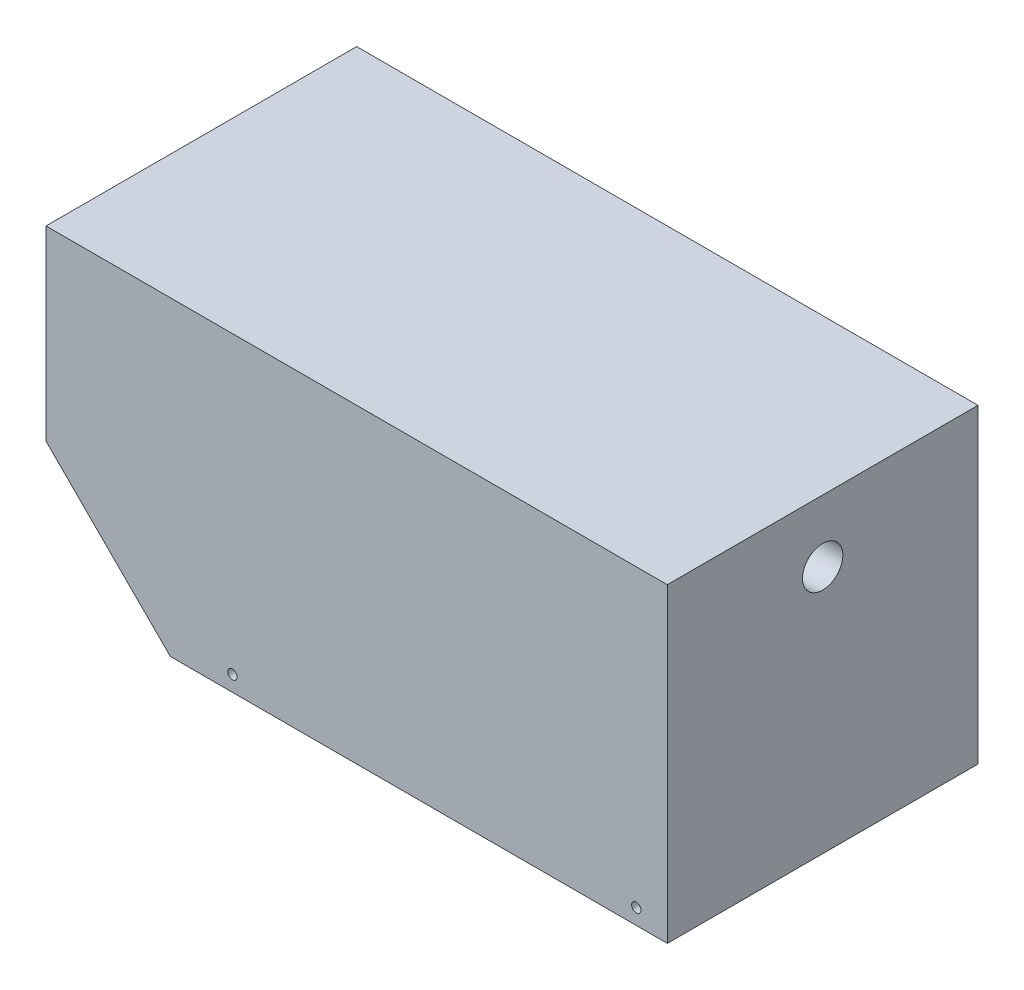
ISO-10303-21;
HEADER;
FILE_DESCRIPTION(('STEP AP214'),'2;1');
FILE_NAME('part.step','',(''),(''),'','','');
FILE_SCHEMA(('AUTOMOTIVE_DESIGN { 1 0 10303 214 1 1 1 1 }'));
ENDSEC;
DATA;
#1=APPLICATION_CONTEXT('core data for automotive mechanical design processes');
#2=APPLICATION_PROTOCOL_DEFINITION('international standard','automotive_design',2000,#1);
#3=PRODUCT_CONTEXT('',#1,'mechanical');
#4=PRODUCT('Part','Part','',(#3));
#5=PRODUCT_RELATED_PRODUCT_CATEGORY('part','',(#4));
#6=PRODUCT_DEFINITION_FORMATION('','',#4);
#7=PRODUCT_DEFINITION_CONTEXT('part definition',#1,'design');
#8=PRODUCT_DEFINITION('design','',#6,#7);
#9=PRODUCT_DEFINITION_SHAPE('','',#8);
#10=(LENGTH_UNIT() NAMED_UNIT(*) SI_UNIT(.MILLI.,.METRE.));
#11=(NAMED_UNIT(*) PLANE_ANGLE_UNIT() SI_UNIT($,.RADIAN.));
#12=(NAMED_UNIT(*) SI_UNIT($,.STERADIAN.) SOLID_ANGLE_UNIT());
#13=UNCERTAINTY_MEASURE_WITH_UNIT(LENGTH_MEASURE(1.E-05),#10,'distance_accuracy_value','');
#14=(GEOMETRIC_REPRESENTATION_CONTEXT(3) GLOBAL_UNCERTAINTY_ASSIGNED_CONTEXT((#13)) GLOBAL_UNIT_ASSIGNED_CONTEXT((#10,
#11,#12)) REPRESENTATION_CONTEXT('',''));
#15=CARTESIAN_POINT('',(0.,0.,0.));
#16=DIRECTION('',(0.,0.,1.));
#17=DIRECTION('',(1.,0.,0.));
#18=AXIS2_PLACEMENT_3D('',#15,#16,#17);
#19=CARTESIAN_POINT('',(-40.,-45.,0.));
#20=DIRECTION('',(0.,0.,1.));
#21=DIRECTION('',(1.,0.,0.));
#22=AXIS2_PLACEMENT_3D('',#19,#20,#21);
#23=CYLINDRICAL_SURFACE('',#22,1.5);
#24=CARTESIAN_POINT('',(-40.,-45.,3.99999999999998));
#25=DIRECTION('',(0.,0.,-1.));
#26=DIRECTION('',(-1.,0.,0.));
#27=AXIS2_PLACEMENT_3D('',#24,#25,#26);
#28=CIRCLE('',#27,1.5);
#29=CARTESIAN_POINT('',(-38.5,-45.,3.99999999999998));
#30=VERTEX_POINT('',#29);
#31=EDGE_CURVE('E149',#30,#30,#28,.F.);
#32=CARTESIAN_POINT('',(-40.,-45.,0.));
#33=DIRECTION('',(0.,0.,1.));
#34=DIRECTION('',(1.,0.,0.));
#35=AXIS2_PLACEMENT_3D('',#32,#33,#34);
#36=CIRCLE('',#35,1.5);
#37=CARTESIAN_POINT('',(-38.5,-45.,0.));
#38=VERTEX_POINT('',#37);
#39=EDGE_CURVE('E160',#38,#38,#36,.T.);
#40=CARTESIAN_POINT('',(-38.5,-45.,3.99999999999998));
#41=CARTESIAN_POINT('',(-38.5,-45.,3.95833333333332));
#42=CARTESIAN_POINT('',(-38.5,-45.,3.91666666666665));
#43=CARTESIAN_POINT('',(-38.5,-45.,3.83333333333332));
#44=CARTESIAN_POINT('',(-38.5,-45.,3.79166666666665));
#45=CARTESIAN_POINT('',(-38.5,-45.,3.70833333333332));
#46=CARTESIAN_POINT('',(-38.5,-45.,3.66666666666665));
#47=CARTESIAN_POINT('',(-38.5,-45.,3.58333333333332));
#48=CARTESIAN_POINT('',(-38.5,-45.,3.54166666666665));
#49=CARTESIAN_POINT('',(-38.5,-45.,3.45833333333332));
#50=CARTESIAN_POINT('',(-38.5,-45.,3.41666666666665));
#51=CARTESIAN_POINT('',(-38.5,-45.,3.33333333333332));
#52=CARTESIAN_POINT('',(-38.5,-45.,3.29166666666665));
#53=CARTESIAN_POINT('',(-38.5,-45.,3.20833333333332));
#54=CARTESIAN_POINT('',(-38.5,-45.,3.16666666666665));
#55=CARTESIAN_POINT('',(-38.5,-45.,3.08333333333332));
#56=CARTESIAN_POINT('',(-38.5,-45.,3.04166666666665));
#57=CARTESIAN_POINT('',(-38.5,-45.,2.95833333333332));
#58=CARTESIAN_POINT('',(-38.5,-45.,2.91666666666665));
#59=CARTESIAN_POINT('',(-38.5,-45.,2.83333333333332));
#60=CARTESIAN_POINT('',(-38.5,-45.,2.79166666666666));
#61=CARTESIAN_POINT('',(-38.5,-45.,2.70833333333332));
#62=CARTESIAN_POINT('',(-38.5,-45.,2.66666666666666));
#63=CARTESIAN_POINT('',(-38.5,-45.,2.58333333333332));
#64=CARTESIAN_POINT('',(-38.5,-45.,2.54166666666666));
#65=CARTESIAN_POINT('',(-38.5,-45.,2.45833333333332));
#66=CARTESIAN_POINT('',(-38.5,-45.,2.41666666666666));
#67=CARTESIAN_POINT('',(-38.5,-45.,2.33333333333332));
#68=CARTESIAN_POINT('',(-38.5,-45.,2.29166666666666));
#69=CARTESIAN_POINT('',(-38.5,-45.,2.20833333333332));
#70=CARTESIAN_POINT('',(-38.5,-45.,2.16666666666666));
#71=CARTESIAN_POINT('',(-38.5,-45.,2.08333333333332));
#72=CARTESIAN_POINT('',(-38.5,-45.,2.04166666666666));
#73=CARTESIAN_POINT('',(-38.5,-45.,1.95833333333333));
#74=CARTESIAN_POINT('',(-38.5,-45.,1.91666666666666));
#75=CARTESIAN_POINT('',(-38.5,-45.,1.83333333333333));
#76=CARTESIAN_POINT('',(-38.5,-45.,1.79166666666666));
#77=CARTESIAN_POINT('',(-38.5,-45.,1.70833333333333));
#78=CARTESIAN_POINT('',(-38.5,-45.,1.66666666666666));
#79=CARTESIAN_POINT('',(-38.5,-45.,1.58333333333333));
#80=CARTESIAN_POINT('',(-38.5,-45.,1.54166666666666));
#81=CARTESIAN_POINT('',(-38.5,-45.,1.45833333333333));
#82=CARTESIAN_POINT('',(-38.5,-45.,1.41666666666666));
#83=CARTESIAN_POINT('',(-38.5,-45.,1.33333333333333));
#84=CARTESIAN_POINT('',(-38.5,-45.,1.29166666666666));
#85=CARTESIAN_POINT('',(-38.5,-45.,1.20833333333333));
#86=CARTESIAN_POINT('',(-38.5,-45.,1.16666666666666));
#87=CARTESIAN_POINT('',(-38.5,-45.,1.08333333333333));
#88=CARTESIAN_POINT('',(-38.5,-45.,1.04166666666666));
#89=CARTESIAN_POINT('',(-38.5,-45.,0.958333333333329));
#90=CARTESIAN_POINT('',(-38.5,-45.,0.916666666666663));
#91=CARTESIAN_POINT('',(-38.5,-45.,0.83333333333333));
#92=CARTESIAN_POINT('',(-38.5,-45.,0.791666666666664));
#93=CARTESIAN_POINT('',(-38.5,-45.,0.708333333333331));
#94=CARTESIAN_POINT('',(-38.5,-45.,0.666666666666664));
#95=CARTESIAN_POINT('',(-38.5,-45.,0.583333333333331));
#96=CARTESIAN_POINT('',(-38.5,-45.,0.541666666666664));
#97=CARTESIAN_POINT('',(-38.5,-45.,0.458333333333331));
#98=CARTESIAN_POINT('',(-38.5,-45.,0.416666666666665));
#99=CARTESIAN_POINT('',(-38.5,-45.,0.333333333333332));
#100=CARTESIAN_POINT('',(-38.5,-45.,0.291666666666665));
#101=CARTESIAN_POINT('',(-38.5,-45.,0.208333333333332));
#102=CARTESIAN_POINT('',(-38.5,-45.,0.166666666666666));
#103=CARTESIAN_POINT('',(-38.5,-45.,0.0833333333333331));
#104=CARTESIAN_POINT('',(-38.5,-45.,0.0416666666666666));
#105=CARTESIAN_POINT('',(-38.5,-45.,0.));
#106=B_SPLINE_CURVE_WITH_KNOTS('',3,(#40,#41,#42,#43,#44,#45,#46,#47,#48,#49,#50,#51,#52,#53,
#54,#55,#56,#57,#58,#59,#60,#61,#62,#63,#64,#65,#66,#67,#68,#69,#70,#71,#72,#73,#74,#75,#76,#77,
#78,#79,#80,#81,#82,#83,#84,#85,#86,#87,#88,#89,#90,#91,#92,#93,#94,#95,#96,#97,#98,#99,#100,
#101,#102,#103,#104,#105),.UNSPECIFIED.,.F.,.F.,(4,2,2,2,2,2,2,2,2,2,2,2,2,2,2,2,2,2,2,2,2,2,2,
2,2,2,2,2,2,2,2,2,4),(0.,0.124999999999999,0.249999999999999,0.374999999999998,
0.499999999999997,0.624999999999997,0.749999999999997,0.874999999999996,0.999999999999996,1.125,
1.24999999999999,1.37499999999999,1.49999999999999,1.62499999999999,1.74999999999999,
1.87499999999999,1.99999999999999,2.12499999999999,2.24999999999999,2.37499999999999,
2.49999999999999,2.62499999999999,2.74999999999999,2.87499999999999,2.99999999999999,
3.12499999999999,3.24999999999999,3.37499999999999,3.49999999999999,3.62499999999999,
3.74999999999998,3.87499999999998,3.99999999999998),.UNSPECIFIED.);
#107=EDGE_CURVE('BSEAM33',#30,#38,#106,.T.);
#108=ORIENTED_EDGE('',*,*,#31,.T.);
#109=ORIENTED_EDGE('',*,*,#39,.F.);
#110=ORIENTED_EDGE('',*,*,#107,.T.);
#111=ORIENTED_EDGE('',*,*,#107,.F.);
#112=EDGE_LOOP('',(#108,#110,#109,#111));
#113=FACE_BOUND('',#112,.T.);
#114=ADVANCED_FACE('F33',(#113),#23,.F.);
#115=CARTESIAN_POINT('',(90.,-45.,0.));
#116=DIRECTION('',(0.,0.,1.));
#117=DIRECTION('',(1.,0.,0.));
#118=AXIS2_PLACEMENT_3D('',#115,#116,#117);
#119=CYLINDRICAL_SURFACE('',#118,1.5);
#120=CARTESIAN_POINT('',(90.,-45.,4.));
#121=DIRECTION('',(0.,0.,-1.));
#122=DIRECTION('',(-1.,0.,0.));
#123=AXIS2_PLACEMENT_3D('',#120,#121,#122);
#124=CIRCLE('',#123,1.5);
#125=CARTESIAN_POINT('',(91.5,-45.,4.));
#126=VERTEX_POINT('',#125);
#127=EDGE_CURVE('E37',#126,#126,#124,.F.);
#128=CARTESIAN_POINT('',(90.,-45.,0.));
#129=DIRECTION('',(0.,0.,1.));
#130=DIRECTION('',(1.,0.,0.));
#131=AXIS2_PLACEMENT_3D('',#128,#129,#130);
#132=CIRCLE('',#131,1.5);
#133=CARTESIAN_POINT('',(91.5,-45.,0.));
#134=VERTEX_POINT('',#133);
#135=EDGE_CURVE('E153',#134,#134,#132,.T.);
#136=CARTESIAN_POINT('',(91.5,-45.,4.));
#137=CARTESIAN_POINT('',(91.5,-45.,3.95833333333333));
#138=CARTESIAN_POINT('',(91.5,-45.,3.91666666666667));
#139=CARTESIAN_POINT('',(91.5,-45.,3.83333333333333));
#140=CARTESIAN_POINT('',(91.5,-45.,3.79166666666667));
#141=CARTESIAN_POINT('',(91.5,-45.,3.70833333333333));
#142=CARTESIAN_POINT('',(91.5,-45.,3.66666666666667));
#143=CARTESIAN_POINT('',(91.5,-45.,3.58333333333333));
#144=CARTESIAN_POINT('',(91.5,-45.,3.54166666666667));
#145=CARTESIAN_POINT('',(91.5,-45.,3.45833333333333));
#146=CARTESIAN_POINT('',(91.5,-45.,3.41666666666667));
#147=CARTESIAN_POINT('',(91.5,-45.,3.33333333333333));
#148=CARTESIAN_POINT('',(91.5,-45.,3.29166666666667));
#149=CARTESIAN_POINT('',(91.5,-45.,3.20833333333333));
#150=CARTESIAN_POINT('',(91.5,-45.,3.16666666666667));
#151=CARTESIAN_POINT('',(91.5,-45.,3.08333333333333));
#152=CARTESIAN_POINT('',(91.5,-45.,3.04166666666667));
#153=CARTESIAN_POINT('',(91.5,-45.,2.95833333333333));
#154=CARTESIAN_POINT('',(91.5,-45.,2.91666666666667));
#155=CARTESIAN_POINT('',(91.5,-45.,2.83333333333333));
#156=CARTESIAN_POINT('',(91.5,-45.,2.79166666666667));
#157=CARTESIAN_POINT('',(91.5,-45.,2.70833333333333));
#158=CARTESIAN_POINT('',(91.5,-45.,2.66666666666667));
#159=CARTESIAN_POINT('',(91.5,-45.,2.58333333333333));
#160=CARTESIAN_POINT('',(91.5,-45.,2.54166666666667));
#161=CARTESIAN_POINT('',(91.5,-45.,2.45833333333333));
#162=CARTESIAN_POINT('',(91.5,-45.,2.41666666666667));
#163=CARTESIAN_POINT('',(91.5,-45.,2.33333333333333));
#164=CARTESIAN_POINT('',(91.5,-45.,2.29166666666667));
#165=CARTESIAN_POINT('',(91.5,-45.,2.20833333333333));
#166=CARTESIAN_POINT('',(91.5,-45.,2.16666666666667));
#167=CARTESIAN_POINT('',(91.5,-45.,2.08333333333333));
#168=CARTESIAN_POINT('',(91.5,-45.,2.04166666666667));
#169=CARTESIAN_POINT('',(91.5,-45.,1.95833333333333));
#170=CARTESIAN_POINT('',(91.5,-45.,1.91666666666667));
#171=CARTESIAN_POINT('',(91.5,-45.,1.83333333333333));
#172=CARTESIAN_POINT('',(91.5,-45.,1.79166666666667));
#173=CARTESIAN_POINT('',(91.5,-45.,1.70833333333333));
#174=CARTESIAN_POINT('',(91.5,-45.,1.66666666666667));
#175=CARTESIAN_POINT('',(91.5,-45.,1.58333333333333));
#176=CARTESIAN_POINT('',(91.5,-45.,1.54166666666667));
#177=CARTESIAN_POINT('',(91.5,-45.,1.45833333333333));
#178=CARTESIAN_POINT('',(91.5,-45.,1.41666666666667));
#179=CARTESIAN_POINT('',(91.5,-45.,1.33333333333333));
#180=CARTESIAN_POINT('',(91.5,-45.,1.29166666666667));
#181=CARTESIAN_POINT('',(91.5,-45.,1.20833333333333));
#182=CARTESIAN_POINT('',(91.5,-45.,1.16666666666667));
#183=CARTESIAN_POINT('',(91.5,-45.,1.08333333333333));
#184=CARTESIAN_POINT('',(91.5,-45.,1.04166666666667));
#185=CARTESIAN_POINT('',(91.5,-45.,0.958333333333334));
#186=CARTESIAN_POINT('',(91.5,-45.,0.916666666666667));
#187=CARTESIAN_POINT('',(91.5,-45.,0.833333333333333));
#188=CARTESIAN_POINT('',(91.5,-45.,0.791666666666667));
#189=CARTESIAN_POINT('',(91.5,-45.,0.708333333333333));
#190=CARTESIAN_POINT('',(91.5,-45.,0.666666666666667));
#191=CARTESIAN_POINT('',(91.5,-45.,0.583333333333333));
#192=CARTESIAN_POINT('',(91.5,-45.,0.541666666666667));
#193=CARTESIAN_POINT('',(91.5,-45.,0.458333333333334));
#194=CARTESIAN_POINT('',(91.5,-45.,0.416666666666667));
#195=CARTESIAN_POINT('',(91.5,-45.,0.333333333333334));
#196=CARTESIAN_POINT('',(91.5,-45.,0.291666666666667));
#197=CARTESIAN_POINT('',(91.5,-45.,0.208333333333333));
#198=CARTESIAN_POINT('',(91.5,-45.,0.166666666666667));
#199=CARTESIAN_POINT('',(91.5,-45.,0.0833333333333334));
#200=CARTESIAN_POINT('',(91.5,-45.,0.0416666666666667));
#201=CARTESIAN_POINT('',(91.5,-45.,0.));
#202=B_SPLINE_CURVE_WITH_KNOTS('',3,(#136,#137,#138,#139,#140,#141,#142,#143,#144,#145,#146,
#147,#148,#149,#150,#151,#152,#153,#154,#155,#156,#157,#158,#159,#160,#161,#162,#163,#164,#165,
#166,#167,#168,#169,#170,#171,#172,#173,#174,#175,#176,#177,#178,#179,#180,#181,#182,#183,#184,
#185,#186,#187,#188,#189,#190,#191,#192,#193,#194,#195,#196,#197,#198,#199,#200,#201),
.UNSPECIFIED.,.F.,.F.,(4,2,2,2,2,2,2,2,2,2,2,2,2,2,2,2,2,2,2,2,2,2,2,2,2,2,2,2,2,2,2,2,4),(0.,
0.125,0.25,0.375,0.5,0.625,0.75,0.875,1.,1.125,1.25,1.375,1.5,1.625,1.75,1.875,2.,2.125,2.25,
2.375,2.5,2.625,2.75,2.875,3.,3.125,3.25,3.375,3.5,3.625,3.75,3.875,4.),.UNSPECIFIED.);
#203=EDGE_CURVE('BSEAM219',#126,#134,#202,.T.);
#204=ORIENTED_EDGE('',*,*,#127,.T.);
#205=ORIENTED_EDGE('',*,*,#135,.F.);
#206=ORIENTED_EDGE('',*,*,#203,.T.);
#207=ORIENTED_EDGE('',*,*,#203,.F.);
#208=EDGE_LOOP('',(#204,#206,#205,#207));
#209=FACE_BOUND('',#208,.T.);
#210=ADVANCED_FACE('F219',(#209),#119,.F.);
#211=CARTESIAN_POINT('',(-100.,-50.,100.));
#212=DIRECTION('',(1.,0.,0.));
#213=DIRECTION('',(0.,0.,-1.));
#214=AXIS2_PLACEMENT_3D('',#211,#212,#213);
#215=PLANE('',#214);
#216=CARTESIAN_POINT('',(-100.,30.,50.));
#217=DIRECTION('',(1.,0.,0.));
#218=DIRECTION('',(0.,0.,-1.));
#219=AXIS2_PLACEMENT_3D('',#216,#217,#218);
#220=CIRCLE('',#219,6.5);
#221=CARTESIAN_POINT('',(-100.,30.,43.5));
#222=VERTEX_POINT('',#221);
#223=EDGE_CURVE('E165',#222,#222,#220,.T.);
#224=ORIENTED_EDGE('',*,*,#223,.T.);
#225=EDGE_LOOP('',(#224));
#226=FACE_BOUND('',#225,.T.);
#227=DIRECTION('',(0.,-1.,0.));
#228=VECTOR('',#227,1.);
#229=CARTESIAN_POINT('',(-100.,-50.,0.));
#230=LINE('',#229,#228);
#231=CARTESIAN_POINT('',(-100.,50.,0.));
#232=VERTEX_POINT('',#231);
#233=CARTESIAN_POINT('',(-100.,-9.99999999999991,0.));
#234=VERTEX_POINT('',#233);
#235=EDGE_CURVE('E168',#232,#234,#230,.T.);
#236=ORIENTED_EDGE('',*,*,#235,.T.);
#237=DIRECTION('',(0.,0.,1.));
#238=VECTOR('',#237,1.);
#239=CARTESIAN_POINT('',(-100.,-9.99999999999991,100.));
#240=LINE('',#239,#238);
#241=CARTESIAN_POINT('',(-100.,-9.99999999999991,100.));
#242=VERTEX_POINT('',#241);
#243=EDGE_CURVE('E42',#234,#242,#240,.T.);
#244=ORIENTED_EDGE('',*,*,#243,.T.);
#245=DIRECTION('',(0.,-1.,0.));
#246=VECTOR('',#245,1.);
#247=CARTESIAN_POINT('',(-100.,-50.,100.));
#248=LINE('',#247,#246);
#249=CARTESIAN_POINT('',(-100.,50.,100.));
#250=VERTEX_POINT('',#249);
#251=EDGE_CURVE('E171',#250,#242,#248,.T.);
#252=ORIENTED_EDGE('',*,*,#251,.F.);
#253=DIRECTION('',(0.,0.,-1.));
#254=VECTOR('',#253,1.);
#255=CARTESIAN_POINT('',(-100.,50.,100.));
#256=LINE('',#255,#254);
#257=EDGE_CURVE('E180',#250,#232,#256,.T.);
#258=ORIENTED_EDGE('',*,*,#257,.T.);
#259=EDGE_LOOP('',(#236,#244,#252,#258));
#260=FACE_BOUND('',#259,.T.);
#261=ADVANCED_FACE('F226',(#226,#260),#215,.F.);
#262=CARTESIAN_POINT('',(100.,-50.,100.));
#263=DIRECTION('',(0.,1.,0.));
#264=DIRECTION('',(-1.,0.,0.));
#265=AXIS2_PLACEMENT_3D('',#262,#263,#264);
#266=PLANE('',#265);
#267=DIRECTION('',(-1.,0.,0.));
#268=VECTOR('',#267,1.);
#269=CARTESIAN_POINT('',(96.,-50.,96.));
#270=LINE('',#269,#268);
#271=CARTESIAN_POINT('',(96.,-50.,96.));
#272=VERTEX_POINT('',#271);
#273=CARTESIAN_POINT('',(-56.,-50.,96.));
#274=VERTEX_POINT('',#273);
#275=EDGE_CURVE('E136',#272,#274,#270,.T.);
#276=ORIENTED_EDGE('',*,*,#275,.F.);
#277=DIRECTION('',(0.,0.,1.));
#278=VECTOR('',#277,1.);
#279=CARTESIAN_POINT('',(96.,-50.,4.));
#280=LINE('',#279,#278);
#281=CARTESIAN_POINT('',(96.,-50.,4.));
#282=VERTEX_POINT('',#281);
#283=EDGE_CURVE('E50',#282,#272,#280,.T.);
#284=ORIENTED_EDGE('',*,*,#283,.F.);
#285=DIRECTION('',(1.,0.,0.));
#286=VECTOR('',#285,1.);
#287=CARTESIAN_POINT('',(96.,-50.,4.));
#288=LINE('',#287,#286);
#289=CARTESIAN_POINT('',(-56.,-50.,3.99999999999998));
#290=VERTEX_POINT('',#289);
#291=EDGE_CURVE('E127',#290,#282,#288,.T.);
#292=ORIENTED_EDGE('',*,*,#291,.F.);
#293=DIRECTION('',(0.,0.,-1.));
#294=VECTOR('',#293,1.);
#295=CARTESIAN_POINT('',(-56.,-50.,3.99999999999998));
#296=LINE('',#295,#294);
#297=EDGE_CURVE('E130',#274,#290,#296,.T.);
#298=ORIENTED_EDGE('',*,*,#297,.F.);
#299=EDGE_LOOP('',(#276,#284,#292,#298));
#300=FACE_BOUND('',#299,.T.);
#301=DIRECTION('',(1.,0.,0.));
#302=VECTOR('',#301,1.);
#303=CARTESIAN_POINT('',(100.,-50.,100.));
#304=LINE('',#303,#302);
#305=CARTESIAN_POINT('',(-60.,-50.,100.));
#306=VERTEX_POINT('',#305);
#307=CARTESIAN_POINT('',(100.,-50.,100.));
#308=VERTEX_POINT('',#307);
#309=EDGE_CURVE('E173',#306,#308,#304,.T.);
#310=ORIENTED_EDGE('',*,*,#309,.F.);
#311=DIRECTION('',(0.,0.,-1.));
#312=VECTOR('',#311,1.);
#313=CARTESIAN_POINT('',(-60.,-50.,100.));
#314=LINE('',#313,#312);
#315=CARTESIAN_POINT('',(-60.,-50.,0.));
#316=VERTEX_POINT('',#315);
#317=EDGE_CURVE('E195',#306,#316,#314,.T.);
#318=ORIENTED_EDGE('',*,*,#317,.T.);
#319=DIRECTION('',(1.,0.,0.));
#320=VECTOR('',#319,1.);
#321=CARTESIAN_POINT('',(100.,-50.,0.));
#322=LINE('',#321,#320);
#323=CARTESIAN_POINT('',(100.,-50.,0.));
#324=VERTEX_POINT('',#323);
#325=EDGE_CURVE('E182',#316,#324,#322,.T.);
#326=ORIENTED_EDGE('',*,*,#325,.T.);
#327=DIRECTION('',(0.,0.,-1.));
#328=VECTOR('',#327,1.);
#329=CARTESIAN_POINT('',(100.,-50.,100.));
#330=LINE('',#329,#328);
#331=EDGE_CURVE('E192',#308,#324,#330,.T.);
#332=ORIENTED_EDGE('',*,*,#331,.F.);
#333=EDGE_LOOP('',(#310,#318,#326,#332));
#334=FACE_BOUND('',#333,.T.);
#335=ADVANCED_FACE('F258',(#300,#334),#266,.F.);
#336=CARTESIAN_POINT('',(100.,-50.,100.));
#337=DIRECTION('',(-1.,0.,0.));
#338=DIRECTION('',(0.,0.,1.));
#339=AXIS2_PLACEMENT_3D('',#336,#337,#338);
#340=PLANE('',#339);
#341=CARTESIAN_POINT('',(100.,30.,50.));
#342=DIRECTION('',(1.,0.,0.));
#343=DIRECTION('',(0.,0.,-1.));
#344=AXIS2_PLACEMENT_3D('',#341,#342,#343);
#345=CIRCLE('',#344,6.5);
#346=CARTESIAN_POINT('',(100.,30.,43.5));
#347=VERTEX_POINT('',#346);
#348=EDGE_CURVE('E156',#347,#347,#345,.T.);
#349=ORIENTED_EDGE('',*,*,#348,.F.);
#350=EDGE_LOOP('',(#349));
#351=FACE_BOUND('',#350,.T.);
#352=DIRECTION('',(0.,1.,0.));
#353=VECTOR('',#352,1.);
#354=CARTESIAN_POINT('',(100.,-50.,0.));
#355=LINE('',#354,#353);
#356=CARTESIAN_POINT('',(100.,50.,0.));
#357=VERTEX_POINT('',#356);
#358=EDGE_CURVE('E184',#324,#357,#355,.T.);
#359=ORIENTED_EDGE('',*,*,#358,.T.);
#360=DIRECTION('',(0.,0.,-1.));
#361=VECTOR('',#360,1.);
#362=CARTESIAN_POINT('',(100.,50.,100.));
#363=LINE('',#362,#361);
#364=CARTESIAN_POINT('',(100.,50.,100.));
#365=VERTEX_POINT('',#364);
#366=EDGE_CURVE('E189',#365,#357,#363,.T.);
#367=ORIENTED_EDGE('',*,*,#366,.F.);
#368=DIRECTION('',(0.,1.,0.));
#369=VECTOR('',#368,1.);
#370=CARTESIAN_POINT('',(100.,-50.,100.));
#371=LINE('',#370,#369);
#372=EDGE_CURVE('E176',#308,#365,#371,.T.);
#373=ORIENTED_EDGE('',*,*,#372,.F.);
#374=ORIENTED_EDGE('',*,*,#331,.T.);
#375=EDGE_LOOP('',(#359,#367,#373,#374));
#376=FACE_BOUND('',#375,.T.);
#377=ADVANCED_FACE('F266',(#351,#376),#340,.F.);
#378=CARTESIAN_POINT('',(100.,50.,100.));
#379=DIRECTION('',(0.,-1.,0.));
#380=DIRECTION('',(1.,0.,0.));
#381=AXIS2_PLACEMENT_3D('',#378,#379,#380);
#382=PLANE('',#381);
#383=DIRECTION('',(-1.,0.,0.));
#384=VECTOR('',#383,1.);
#385=CARTESIAN_POINT('',(100.,50.,0.));
#386=LINE('',#385,#384);
#387=EDGE_CURVE('E174',#357,#232,#386,.T.);
#388=ORIENTED_EDGE('',*,*,#387,.T.);
#389=ORIENTED_EDGE('',*,*,#257,.F.);
#390=DIRECTION('',(-1.,0.,0.));
#391=VECTOR('',#390,1.);
#392=CARTESIAN_POINT('',(100.,50.,100.));
#393=LINE('',#392,#391);
#394=EDGE_CURVE('E178',#365,#250,#393,.T.);
#395=ORIENTED_EDGE('',*,*,#394,.F.);
#396=ORIENTED_EDGE('',*,*,#366,.T.);
#397=EDGE_LOOP('',(#388,#389,#395,#396));
#398=FACE_BOUND('',#397,.T.);
#399=ADVANCED_FACE('F247',(#398),#382,.F.);
#400=CARTESIAN_POINT('',(0.,0.,100.));
#401=DIRECTION('',(0.,0.,1.));
#402=DIRECTION('',(1.,0.,0.));
#403=AXIS2_PLACEMENT_3D('',#400,#401,#402);
#404=PLANE('',#403);
#405=CARTESIAN_POINT('',(90.,-45.,100.));
#406=DIRECTION('',(0.,0.,1.));
#407=DIRECTION('',(1.,0.,0.));
#408=AXIS2_PLACEMENT_3D('',#405,#406,#407);
#409=CIRCLE('',#408,1.5);
#410=CARTESIAN_POINT('',(91.5,-45.,100.));
#411=VERTEX_POINT('',#410);
#412=EDGE_CURVE('E157',#411,#411,#409,.T.);
#413=ORIENTED_EDGE('',*,*,#412,.F.);
#414=EDGE_LOOP('',(#413));
#415=FACE_BOUND('',#414,.T.);
#416=CARTESIAN_POINT('',(-40.,-45.,100.));
#417=DIRECTION('',(0.,0.,1.));
#418=DIRECTION('',(1.,0.,0.));
#419=AXIS2_PLACEMENT_3D('',#416,#417,#418);
#420=CIRCLE('',#419,1.5);
#421=CARTESIAN_POINT('',(-38.5,-45.,100.));
#422=VERTEX_POINT('',#421);
#423=EDGE_CURVE('E152',#422,#422,#420,.T.);
#424=ORIENTED_EDGE('',*,*,#423,.F.);
#425=EDGE_LOOP('',(#424));
#426=FACE_BOUND('',#425,.T.);
#427=ORIENTED_EDGE('',*,*,#251,.T.);
#428=DIRECTION('',(-0.707106781186547,0.707106781186549,0.));
#429=VECTOR('',#428,1.);
#430=CARTESIAN_POINT('',(-55.0000000000001,-54.9999999999999,100.));
#431=LINE('',#430,#429);
#432=EDGE_CURVE('E11',#242,#306,#431,.F.);
#433=ORIENTED_EDGE('',*,*,#432,.T.);
#434=ORIENTED_EDGE('',*,*,#309,.T.);
#435=ORIENTED_EDGE('',*,*,#372,.T.);
#436=ORIENTED_EDGE('',*,*,#394,.T.);
#437=EDGE_LOOP('',(#427,#433,#434,#435,#436));
#438=FACE_BOUND('',#437,.T.);
#439=ADVANCED_FACE('F243',(#415,#426,#438),#404,.T.);
#440=CARTESIAN_POINT('',(0.,0.,0.));
#441=DIRECTION('',(0.,0.,1.));
#442=DIRECTION('',(1.,0.,0.));
#443=AXIS2_PLACEMENT_3D('',#440,#441,#442);
#444=PLANE('',#443);
#445=ORIENTED_EDGE('',*,*,#135,.T.);
#446=EDGE_LOOP('',(#445));
#447=FACE_BOUND('',#446,.T.);
#448=ORIENTED_EDGE('',*,*,#39,.T.);
#449=EDGE_LOOP('',(#448));
#450=FACE_BOUND('',#449,.T.);
#451=ORIENTED_EDGE('',*,*,#325,.F.);
#452=DIRECTION('',(0.707106781186547,-0.707106781186549,0.));
#453=VECTOR('',#452,1.);
#454=CARTESIAN_POINT('',(-60.,-50.,0.));
#455=LINE('',#454,#453);
#456=EDGE_CURVE('E198',#316,#234,#455,.F.);
#457=ORIENTED_EDGE('',*,*,#456,.T.);
#458=ORIENTED_EDGE('',*,*,#235,.F.);
#459=ORIENTED_EDGE('',*,*,#387,.F.);
#460=ORIENTED_EDGE('',*,*,#358,.F.);
#461=EDGE_LOOP('',(#451,#457,#458,#459,#460));
#462=FACE_BOUND('',#461,.T.);
#463=ADVANCED_FACE('F246',(#447,#450,#462),#444,.F.);
#464=CARTESIAN_POINT('',(-60.,-50.,100.));
#465=DIRECTION('',(0.707106781186549,0.707106781186547,0.));
#466=DIRECTION('',(0.,0.,-1.));
#467=AXIS2_PLACEMENT_3D('',#464,#465,#466);
#468=PLANE('',#467);
#469=ORIENTED_EDGE('',*,*,#432,.F.);
#470=ORIENTED_EDGE('',*,*,#243,.F.);
#471=ORIENTED_EDGE('',*,*,#456,.F.);
#472=ORIENTED_EDGE('',*,*,#317,.F.);
#473=EDGE_LOOP('',(#469,#470,#471,#472));
#474=FACE_BOUND('',#473,.T.);
#475=ADVANCED_FACE('F35',(#474),#468,.F.);
#476=CARTESIAN_POINT('',(-100.,30.,50.));
#477=DIRECTION('',(1.,0.,0.));
#478=DIRECTION('',(0.,0.,-1.));
#479=AXIS2_PLACEMENT_3D('',#476,#477,#478);
#480=CYLINDRICAL_SURFACE('',#479,6.5);
#481=ORIENTED_EDGE('',*,*,#223,.F.);
#482=EDGE_LOOP('',(#481));
#483=FACE_BOUND('',#482,.T.);
#484=ORIENTED_EDGE('',*,*,#348,.T.);
#485=EDGE_LOOP('',(#484));
#486=FACE_BOUND('',#485,.T.);
#487=ADVANCED_FACE('F232',(#483,#486),#480,.F.);
#488=CARTESIAN_POINT('',(-40.,-45.,96.));
#489=DIRECTION('',(0.,0.,1.));
#490=DIRECTION('',(1.,0.,0.));
#491=AXIS2_PLACEMENT_3D('',#488,#489,#490);
#492=CIRCLE('',#491,1.5);
#493=CARTESIAN_POINT('',(-38.5,-45.,96.));
#494=VERTEX_POINT('',#493);
#495=EDGE_CURVE('E146',#494,#494,#492,.F.);
#496=CARTESIAN_POINT('',(-38.5,-45.,96.));
#497=CARTESIAN_POINT('',(-38.5,-45.,96.0416666666667));
#498=CARTESIAN_POINT('',(-38.5,-45.,96.0833333333333));
#499=CARTESIAN_POINT('',(-38.5,-45.,96.1666666666667));
#500=CARTESIAN_POINT('',(-38.5,-45.,96.2083333333333));
#501=CARTESIAN_POINT('',(-38.5,-45.,96.2916666666667));
#502=CARTESIAN_POINT('',(-38.5,-45.,96.3333333333333));
#503=CARTESIAN_POINT('',(-38.5,-45.,96.4166666666667));
#504=CARTESIAN_POINT('',(-38.5,-45.,96.4583333333333));
#505=CARTESIAN_POINT('',(-38.5,-45.,96.5416666666667));
#506=CARTESIAN_POINT('',(-38.5,-45.,96.5833333333333));
#507=CARTESIAN_POINT('',(-38.5,-45.,96.6666666666667));
#508=CARTESIAN_POINT('',(-38.5,-45.,96.7083333333333));
#509=CARTESIAN_POINT('',(-38.5,-45.,96.7916666666667));
#510=CARTESIAN_POINT('',(-38.5,-45.,96.8333333333333));
#511=CARTESIAN_POINT('',(-38.5,-45.,96.9166666666667));
#512=CARTESIAN_POINT('',(-38.5,-45.,96.9583333333333));
#513=CARTESIAN_POINT('',(-38.5,-45.,97.0416666666667));
#514=CARTESIAN_POINT('',(-38.5,-45.,97.0833333333333));
#515=CARTESIAN_POINT('',(-38.5,-45.,97.1666666666667));
#516=CARTESIAN_POINT('',(-38.5,-45.,97.2083333333333));
#517=CARTESIAN_POINT('',(-38.5,-45.,97.2916666666667));
#518=CARTESIAN_POINT('',(-38.5,-45.,97.3333333333333));
#519=CARTESIAN_POINT('',(-38.5,-45.,97.4166666666667));
#520=CARTESIAN_POINT('',(-38.5,-45.,97.4583333333333));
#521=CARTESIAN_POINT('',(-38.5,-45.,97.5416666666667));
#522=CARTESIAN_POINT('',(-38.5,-45.,97.5833333333333));
#523=CARTESIAN_POINT('',(-38.5,-45.,97.6666666666667));
#524=CARTESIAN_POINT('',(-38.5,-45.,97.7083333333333));
#525=CARTESIAN_POINT('',(-38.5,-45.,97.7916666666667));
#526=CARTESIAN_POINT('',(-38.5,-45.,97.8333333333333));
#527=CARTESIAN_POINT('',(-38.5,-45.,97.9166666666667));
#528=CARTESIAN_POINT('',(-38.5,-45.,97.9583333333333));
#529=CARTESIAN_POINT('',(-38.5,-45.,98.0416666666667));
#530=CARTESIAN_POINT('',(-38.5,-45.,98.0833333333333));
#531=CARTESIAN_POINT('',(-38.5,-45.,98.1666666666667));
#532=CARTESIAN_POINT('',(-38.5,-45.,98.2083333333333));
#533=CARTESIAN_POINT('',(-38.5,-45.,98.2916666666667));
#534=CARTESIAN_POINT('',(-38.5,-45.,98.3333333333333));
#535=CARTESIAN_POINT('',(-38.5,-45.,98.4166666666667));
#536=CARTESIAN_POINT('',(-38.5,-45.,98.4583333333333));
#537=CARTESIAN_POINT('',(-38.5,-45.,98.5416666666667));
#538=CARTESIAN_POINT('',(-38.5,-45.,98.5833333333333));
#539=CARTESIAN_POINT('',(-38.5,-45.,98.6666666666667));
#540=CARTESIAN_POINT('',(-38.5,-45.,98.7083333333333));
#541=CARTESIAN_POINT('',(-38.5,-45.,98.7916666666667));
#542=CARTESIAN_POINT('',(-38.5,-45.,98.8333333333333));
#543=CARTESIAN_POINT('',(-38.5,-45.,98.9166666666667));
#544=CARTESIAN_POINT('',(-38.5,-45.,98.9583333333333));
#545=CARTESIAN_POINT('',(-38.5,-45.,99.0416666666667));
#546=CARTESIAN_POINT('',(-38.5,-45.,99.0833333333333));
#547=CARTESIAN_POINT('',(-38.5,-45.,99.1666666666667));
#548=CARTESIAN_POINT('',(-38.5,-45.,99.2083333333333));
#549=CARTESIAN_POINT('',(-38.5,-45.,99.2916666666667));
#550=CARTESIAN_POINT('',(-38.5,-45.,99.3333333333333));
#551=CARTESIAN_POINT('',(-38.5,-45.,99.4166666666667));
#552=CARTESIAN_POINT('',(-38.5,-45.,99.4583333333333));
#553=CARTESIAN_POINT('',(-38.5,-45.,99.5416666666667));
#554=CARTESIAN_POINT('',(-38.5,-45.,99.5833333333333));
#555=CARTESIAN_POINT('',(-38.5,-45.,99.6666666666667));
#556=CARTESIAN_POINT('',(-38.5,-45.,99.7083333333333));
#557=CARTESIAN_POINT('',(-38.5,-45.,99.7916666666667));
#558=CARTESIAN_POINT('',(-38.5,-45.,99.8333333333333));
#559=CARTESIAN_POINT('',(-38.5,-45.,99.9166666666667));
#560=CARTESIAN_POINT('',(-38.5,-45.,99.9583333333333));
#561=CARTESIAN_POINT('',(-38.5,-45.,100.));
#562=B_SPLINE_CURVE_WITH_KNOTS('',3,(#496,#497,#498,#499,#500,#501,#502,#503,#504,#505,#506,
#507,#508,#509,#510,#511,#512,#513,#514,#515,#516,#517,#518,#519,#520,#521,#522,#523,#524,#525,
#526,#527,#528,#529,#530,#531,#532,#533,#534,#535,#536,#537,#538,#539,#540,#541,#542,#543,#544,
#545,#546,#547,#548,#549,#550,#551,#552,#553,#554,#555,#556,#557,#558,#559,#560,#561),
.UNSPECIFIED.,.F.,.F.,(4,2,2,2,2,2,2,2,2,2,2,2,2,2,2,2,2,2,2,2,2,2,2,2,2,2,2,2,2,2,2,2,4),(0.,
0.125,0.25,0.375,0.5,0.625000000000001,0.750000000000001,0.875000000000001,1.,1.125,1.25,1.375,
1.5,1.625,1.75,1.875,2.,2.125,2.25,2.375,2.5,2.625,2.75,2.875,3.,3.125,3.25,3.375,3.5,3.625,
3.75,3.875,4.),.UNSPECIFIED.);
#563=EDGE_CURVE('BSEAM222',#494,#422,#562,.T.);
#564=ORIENTED_EDGE('',*,*,#495,.T.);
#565=ORIENTED_EDGE('',*,*,#423,.T.);
#566=ORIENTED_EDGE('',*,*,#563,.T.);
#567=ORIENTED_EDGE('',*,*,#563,.F.);
#568=EDGE_LOOP('',(#564,#566,#565,#567));
#569=FACE_BOUND('',#568,.T.);
#570=ADVANCED_FACE('F222',(#569),#23,.F.);
#571=CARTESIAN_POINT('',(90.,-45.,96.));
#572=DIRECTION('',(0.,0.,1.));
#573=DIRECTION('',(1.,0.,0.));
#574=AXIS2_PLACEMENT_3D('',#571,#572,#573);
#575=CIRCLE('',#574,1.5);
#576=CARTESIAN_POINT('',(91.5,-45.,96.));
#577=VERTEX_POINT('',#576);
#578=EDGE_CURVE('E142',#577,#577,#575,.F.);
#579=CARTESIAN_POINT('',(91.5,-45.,96.));
#580=CARTESIAN_POINT('',(91.5,-45.,96.0416666666667));
#581=CARTESIAN_POINT('',(91.5,-45.,96.0833333333333));
#582=CARTESIAN_POINT('',(91.5,-45.,96.1666666666667));
#583=CARTESIAN_POINT('',(91.5,-45.,96.2083333333333));
#584=CARTESIAN_POINT('',(91.5,-45.,96.2916666666667));
#585=CARTESIAN_POINT('',(91.5,-45.,96.3333333333333));
#586=CARTESIAN_POINT('',(91.5,-45.,96.4166666666667));
#587=CARTESIAN_POINT('',(91.5,-45.,96.4583333333333));
#588=CARTESIAN_POINT('',(91.5,-45.,96.5416666666667));
#589=CARTESIAN_POINT('',(91.5,-45.,96.5833333333333));
#590=CARTESIAN_POINT('',(91.5,-45.,96.6666666666667));
#591=CARTESIAN_POINT('',(91.5,-45.,96.7083333333333));
#592=CARTESIAN_POINT('',(91.5,-45.,96.7916666666667));
#593=CARTESIAN_POINT('',(91.5,-45.,96.8333333333333));
#594=CARTESIAN_POINT('',(91.5,-45.,96.9166666666667));
#595=CARTESIAN_POINT('',(91.5,-45.,96.9583333333333));
#596=CARTESIAN_POINT('',(91.5,-45.,97.0416666666667));
#597=CARTESIAN_POINT('',(91.5,-45.,97.0833333333333));
#598=CARTESIAN_POINT('',(91.5,-45.,97.1666666666667));
#599=CARTESIAN_POINT('',(91.5,-45.,97.2083333333333));
#600=CARTESIAN_POINT('',(91.5,-45.,97.2916666666667));
#601=CARTESIAN_POINT('',(91.5,-45.,97.3333333333333));
#602=CARTESIAN_POINT('',(91.5,-45.,97.4166666666667));
#603=CARTESIAN_POINT('',(91.5,-45.,97.4583333333333));
#604=CARTESIAN_POINT('',(91.5,-45.,97.5416666666667));
#605=CARTESIAN_POINT('',(91.5,-45.,97.5833333333333));
#606=CARTESIAN_POINT('',(91.5,-45.,97.6666666666667));
#607=CARTESIAN_POINT('',(91.5,-45.,97.7083333333333));
#608=CARTESIAN_POINT('',(91.5,-45.,97.7916666666667));
#609=CARTESIAN_POINT('',(91.5,-45.,97.8333333333333));
#610=CARTESIAN_POINT('',(91.5,-45.,97.9166666666667));
#611=CARTESIAN_POINT('',(91.5,-45.,97.9583333333333));
#612=CARTESIAN_POINT('',(91.5,-45.,98.0416666666667));
#613=CARTESIAN_POINT('',(91.5,-45.,98.0833333333333));
#614=CARTESIAN_POINT('',(91.5,-45.,98.1666666666667));
#615=CARTESIAN_POINT('',(91.5,-45.,98.2083333333333));
#616=CARTESIAN_POINT('',(91.5,-45.,98.2916666666667));
#617=CARTESIAN_POINT('',(91.5,-45.,98.3333333333333));
#618=CARTESIAN_POINT('',(91.5,-45.,98.4166666666667));
#619=CARTESIAN_POINT('',(91.5,-45.,98.4583333333333));
#620=CARTESIAN_POINT('',(91.5,-45.,98.5416666666667));
#621=CARTESIAN_POINT('',(91.5,-45.,98.5833333333333));
#622=CARTESIAN_POINT('',(91.5,-45.,98.6666666666667));
#623=CARTESIAN_POINT('',(91.5,-45.,98.7083333333333));
#624=CARTESIAN_POINT('',(91.5,-45.,98.7916666666667));
#625=CARTESIAN_POINT('',(91.5,-45.,98.8333333333333));
#626=CARTESIAN_POINT('',(91.5,-45.,98.9166666666667));
#627=CARTESIAN_POINT('',(91.5,-45.,98.9583333333333));
#628=CARTESIAN_POINT('',(91.5,-45.,99.0416666666667));
#629=CARTESIAN_POINT('',(91.5,-45.,99.0833333333333));
#630=CARTESIAN_POINT('',(91.5,-45.,99.1666666666667));
#631=CARTESIAN_POINT('',(91.5,-45.,99.2083333333333));
#632=CARTESIAN_POINT('',(91.5,-45.,99.2916666666667));
#633=CARTESIAN_POINT('',(91.5,-45.,99.3333333333333));
#634=CARTESIAN_POINT('',(91.5,-45.,99.4166666666667));
#635=CARTESIAN_POINT('',(91.5,-45.,99.4583333333333));
#636=CARTESIAN_POINT('',(91.5,-45.,99.5416666666667));
#637=CARTESIAN_POINT('',(91.5,-45.,99.5833333333333));
#638=CARTESIAN_POINT('',(91.5,-45.,99.6666666666667));
#639=CARTESIAN_POINT('',(91.5,-45.,99.7083333333333));
#640=CARTESIAN_POINT('',(91.5,-45.,99.7916666666667));
#641=CARTESIAN_POINT('',(91.5,-45.,99.8333333333333));
#642=CARTESIAN_POINT('',(91.5,-45.,99.9166666666667));
#643=CARTESIAN_POINT('',(91.5,-45.,99.9583333333333));
#644=CARTESIAN_POINT('',(91.5,-45.,100.));
#645=B_SPLINE_CURVE_WITH_KNOTS('',3,(#579,#580,#581,#582,#583,#584,#585,#586,#587,#588,#589,
#590,#591,#592,#593,#594,#595,#596,#597,#598,#599,#600,#601,#602,#603,#604,#605,#606,#607,#608,
#609,#610,#611,#612,#613,#614,#615,#616,#617,#618,#619,#620,#621,#622,#623,#624,#625,#626,#627,
#628,#629,#630,#631,#632,#633,#634,#635,#636,#637,#638,#639,#640,#641,#642,#643,#644),
.UNSPECIFIED.,.F.,.F.,(4,2,2,2,2,2,2,2,2,2,2,2,2,2,2,2,2,2,2,2,2,2,2,2,2,2,2,2,2,2,2,2,4),(0.,
0.125,0.25,0.375,0.5,0.625000000000001,0.750000000000001,0.875000000000001,1.,1.125,1.25,1.375,
1.5,1.625,1.75,1.875,2.,2.125,2.25,2.375,2.5,2.625,2.75,2.875,3.,3.125,3.25,3.375,3.5,3.625,
3.75,3.875,4.),.UNSPECIFIED.);
#646=EDGE_CURVE('BSEAM203',#577,#411,#645,.T.);
#647=ORIENTED_EDGE('',*,*,#578,.T.);
#648=ORIENTED_EDGE('',*,*,#412,.T.);
#649=ORIENTED_EDGE('',*,*,#646,.T.);
#650=ORIENTED_EDGE('',*,*,#646,.F.);
#651=EDGE_LOOP('',(#647,#649,#648,#650));
#652=FACE_BOUND('',#651,.T.);
#653=ADVANCED_FACE('F203',(#652),#119,.F.);
#654=CARTESIAN_POINT('',(96.,20.,4.));
#655=DIRECTION('',(0.,0.,-1.));
#656=DIRECTION('',(-1.,0.,0.));
#657=AXIS2_PLACEMENT_3D('',#654,#655,#656);
#658=PLANE('',#657);
#659=ORIENTED_EDGE('',*,*,#127,.F.);
#660=EDGE_LOOP('',(#659));
#661=FACE_BOUND('',#660,.T.);
#662=ORIENTED_EDGE('',*,*,#291,.T.);
#663=DIRECTION('',(0.,-1.,0.));
#664=VECTOR('',#663,1.);
#665=CARTESIAN_POINT('',(96.,20.,4.));
#666=LINE('',#665,#664);
#667=CARTESIAN_POINT('',(96.,20.,4.));
#668=VERTEX_POINT('',#667);
#669=EDGE_CURVE('E140',#668,#282,#666,.T.);
#670=ORIENTED_EDGE('',*,*,#669,.F.);
#671=DIRECTION('',(1.,0.,0.));
#672=VECTOR('',#671,1.);
#673=CARTESIAN_POINT('',(96.,20.,4.));
#674=LINE('',#673,#672);
#675=CARTESIAN_POINT('',(-56.,20.,3.99999999999998));
#676=VERTEX_POINT('',#675);
#677=EDGE_CURVE('E114',#676,#668,#674,.T.);
#678=ORIENTED_EDGE('',*,*,#677,.F.);
#679=DIRECTION('',(0.,-1.,0.));
#680=VECTOR('',#679,1.);
#681=CARTESIAN_POINT('',(-56.,20.,3.99999999999998));
#682=LINE('',#681,#680);
#683=EDGE_CURVE('E143',#676,#290,#682,.T.);
#684=ORIENTED_EDGE('',*,*,#683,.T.);
#685=EDGE_LOOP('',(#662,#670,#678,#684));
#686=FACE_BOUND('',#685,.T.);
#687=ORIENTED_EDGE('',*,*,#31,.F.);
#688=EDGE_LOOP('',(#687));
#689=FACE_BOUND('',#688,.T.);
#690=ADVANCED_FACE('F207',(#661,#686,#689),#658,.F.);
#691=CARTESIAN_POINT('',(96.,20.,96.));
#692=DIRECTION('',(0.,0.,1.));
#693=DIRECTION('',(1.,0.,0.));
#694=AXIS2_PLACEMENT_3D('',#691,#692,#693);
#695=PLANE('',#694);
#696=ORIENTED_EDGE('',*,*,#578,.F.);
#697=EDGE_LOOP('',(#696));
#698=FACE_BOUND('',#697,.T.);
#699=ORIENTED_EDGE('',*,*,#275,.T.);
#700=DIRECTION('',(0.,-1.,0.));
#701=VECTOR('',#700,1.);
#702=CARTESIAN_POINT('',(-56.,20.,96.));
#703=LINE('',#702,#701);
#704=CARTESIAN_POINT('',(-56.,20.,96.));
#705=VERTEX_POINT('',#704);
#706=EDGE_CURVE('E113',#705,#274,#703,.T.);
#707=ORIENTED_EDGE('',*,*,#706,.F.);
#708=DIRECTION('',(-1.,0.,0.));
#709=VECTOR('',#708,1.);
#710=CARTESIAN_POINT('',(96.,20.,96.));
#711=LINE('',#710,#709);
#712=CARTESIAN_POINT('',(96.,20.,96.));
#713=VERTEX_POINT('',#712);
#714=EDGE_CURVE('E117',#713,#705,#711,.T.);
#715=ORIENTED_EDGE('',*,*,#714,.F.);
#716=DIRECTION('',(0.,-1.,0.));
#717=VECTOR('',#716,1.);
#718=CARTESIAN_POINT('',(96.,20.,96.));
#719=LINE('',#718,#717);
#720=EDGE_CURVE('E104',#713,#272,#719,.T.);
#721=ORIENTED_EDGE('',*,*,#720,.T.);
#722=EDGE_LOOP('',(#699,#707,#715,#721));
#723=FACE_BOUND('',#722,.T.);
#724=ORIENTED_EDGE('',*,*,#495,.F.);
#725=EDGE_LOOP('',(#724));
#726=FACE_BOUND('',#725,.T.);
#727=ADVANCED_FACE('F118',(#698,#723,#726),#695,.F.);
#728=CARTESIAN_POINT('',(96.,20.,4.));
#729=DIRECTION('',(1.,0.,0.));
#730=DIRECTION('',(0.,1.,0.));
#731=AXIS2_PLACEMENT_3D('',#728,#729,#730);
#732=PLANE('',#731);
#733=ORIENTED_EDGE('',*,*,#283,.T.);
#734=ORIENTED_EDGE('',*,*,#720,.F.);
#735=DIRECTION('',(0.,0.,1.));
#736=VECTOR('',#735,1.);
#737=CARTESIAN_POINT('',(96.,20.,4.));
#738=LINE('',#737,#736);
#739=EDGE_CURVE('E108',#668,#713,#738,.T.);
#740=ORIENTED_EDGE('',*,*,#739,.F.);
#741=ORIENTED_EDGE('',*,*,#669,.T.);
#742=EDGE_LOOP('',(#733,#734,#740,#741));
#743=FACE_BOUND('',#742,.T.);
#744=ADVANCED_FACE('F106',(#743),#732,.F.);
#745=CARTESIAN_POINT('',(-56.,20.,3.99999999999998));
#746=DIRECTION('',(-1.,0.,0.));
#747=DIRECTION('',(0.,-1.,0.));
#748=AXIS2_PLACEMENT_3D('',#745,#746,#747);
#749=PLANE('',#748);
#750=ORIENTED_EDGE('',*,*,#297,.T.);
#751=ORIENTED_EDGE('',*,*,#683,.F.);
#752=DIRECTION('',(0.,0.,-1.));
#753=VECTOR('',#752,1.);
#754=CARTESIAN_POINT('',(-56.,20.,3.99999999999998));
#755=LINE('',#754,#753);
#756=EDGE_CURVE('E123',#705,#676,#755,.T.);
#757=ORIENTED_EDGE('',*,*,#756,.F.);
#758=ORIENTED_EDGE('',*,*,#706,.T.);
#759=EDGE_LOOP('',(#750,#751,#757,#758));
#760=FACE_BOUND('',#759,.T.);
#761=ADVANCED_FACE('F213',(#760),#749,.F.);
#762=CARTESIAN_POINT('',(0.,20.,0.));
#763=DIRECTION('',(0.,-1.,0.));
#764=DIRECTION('',(1.,0.,0.));
#765=AXIS2_PLACEMENT_3D('',#762,#763,#764);
#766=PLANE('',#765);
#767=ORIENTED_EDGE('',*,*,#739,.T.);
#768=ORIENTED_EDGE('',*,*,#714,.T.);
#769=ORIENTED_EDGE('',*,*,#756,.T.);
#770=ORIENTED_EDGE('',*,*,#677,.T.);
#771=EDGE_LOOP('',(#767,#768,#769,#770));
#772=FACE_BOUND('',#771,.T.);
#773=ADVANCED_FACE('F125',(#772),#766,.T.);
#774=CLOSED_SHELL('',(#114,#210,#261,#335,#377,#399,#439,#463,#475,#487,#570,#653,#690,#727,
#744,#761,#773));
#775=MANIFOLD_SOLID_BREP('B2',#774);
#776=ADVANCED_BREP_SHAPE_REPRESENTATION('',(#18,#775),#14);
#777=SHAPE_DEFINITION_REPRESENTATION(#9,#776);
ENDSEC;
END-ISO-10303-21;
